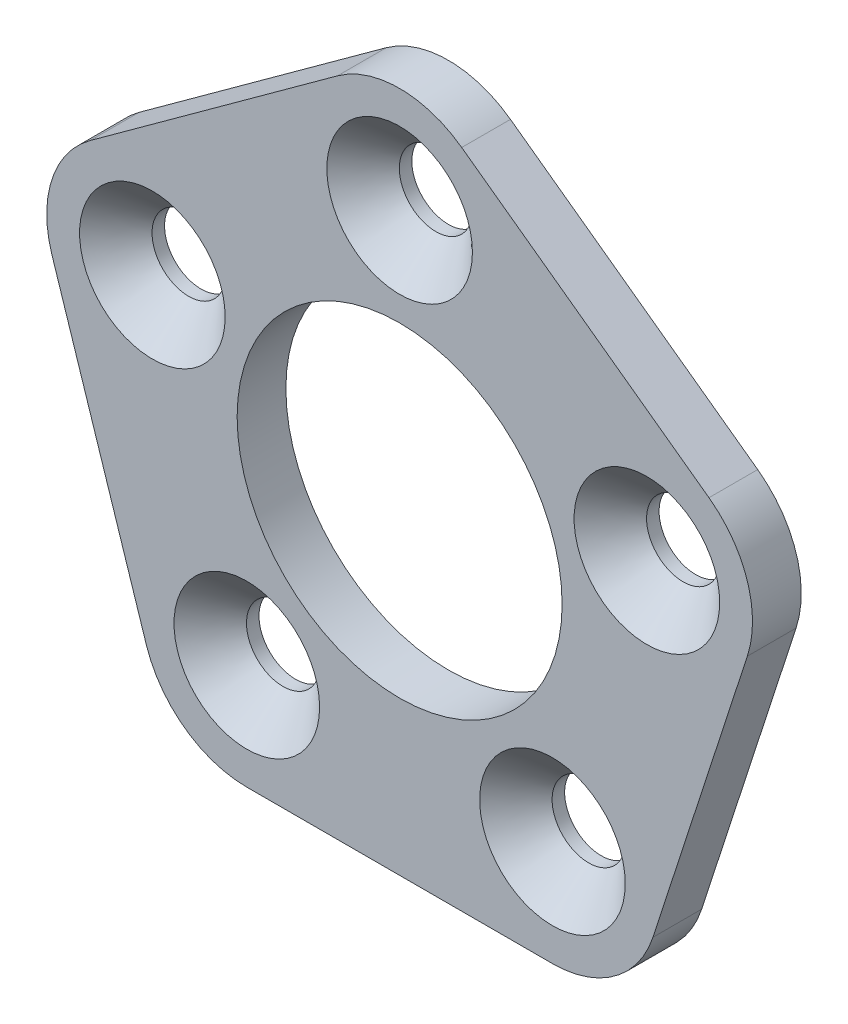
ISO-10303-21;
HEADER;
FILE_DESCRIPTION(('STEP AP214'),'2;1');
FILE_NAME('part.step','',(''),(''),'','','');
FILE_SCHEMA(('AUTOMOTIVE_DESIGN { 1 0 10303 214 1 1 1 1 }'));
ENDSEC;
DATA;
#1=APPLICATION_CONTEXT('core data for automotive mechanical design processes');
#2=APPLICATION_PROTOCOL_DEFINITION('international standard','automotive_design',2000,#1);
#3=PRODUCT_CONTEXT('',#1,'mechanical');
#4=PRODUCT('Part','Part','',(#3));
#5=PRODUCT_RELATED_PRODUCT_CATEGORY('part','',(#4));
#6=PRODUCT_DEFINITION_FORMATION('','',#4);
#7=PRODUCT_DEFINITION_CONTEXT('part definition',#1,'design');
#8=PRODUCT_DEFINITION('design','',#6,#7);
#9=PRODUCT_DEFINITION_SHAPE('','',#8);
#10=(LENGTH_UNIT() NAMED_UNIT(*) SI_UNIT(.MILLI.,.METRE.));
#11=(NAMED_UNIT(*) PLANE_ANGLE_UNIT() SI_UNIT($,.RADIAN.));
#12=(NAMED_UNIT(*) SI_UNIT($,.STERADIAN.) SOLID_ANGLE_UNIT());
#13=UNCERTAINTY_MEASURE_WITH_UNIT(LENGTH_MEASURE(1.E-05),#10,'distance_accuracy_value','');
#14=(GEOMETRIC_REPRESENTATION_CONTEXT(3) GLOBAL_UNCERTAINTY_ASSIGNED_CONTEXT((#13)) GLOBAL_UNIT_ASSIGNED_CONTEXT((#10,
#11,#12)) REPRESENTATION_CONTEXT('',''));
#15=CARTESIAN_POINT('',(0.,0.,0.));
#16=DIRECTION('',(0.,0.,1.));
#17=DIRECTION('',(1.,0.,0.));
#18=AXIS2_PLACEMENT_3D('',#15,#16,#17);
#19=CARTESIAN_POINT('',(-15.2169042607225,4.94427190999915,-3.));
#20=DIRECTION('',(0.,0.,1.));
#21=DIRECTION('',(1.,0.,0.));
#22=AXIS2_PLACEMENT_3D('',#19,#20,#21);
#23=CYLINDRICAL_SURFACE('',#22,6.50000000000001);
#24=CARTESIAN_POINT('',(-15.2169042607225,4.94427190999915,0.));
#25=DIRECTION('',(0.,0.,1.));
#26=DIRECTION('',(1.,0.,0.));
#27=AXIS2_PLACEMENT_3D('',#24,#25,#26);
#28=CIRCLE('',#27,6.50000000000001);
#29=CARTESIAN_POINT('',(-19.0375084006235,10.2028823734363,0.));
#30=VERTEX_POINT('',#29);
#31=CARTESIAN_POINT('',(-21.398771616641,2.93566144656199,0.));
#32=VERTEX_POINT('',#31);
#33=EDGE_CURVE('E159',#30,#32,#28,.T.);
#34=ORIENTED_EDGE('',*,*,#33,.F.);
#35=DIRECTION('',(0.,0.,1.));
#36=VECTOR('',#35,1.);
#37=CARTESIAN_POINT('',(-19.0375084006235,10.2028823734363,-3.));
#38=LINE('',#37,#36);
#39=CARTESIAN_POINT('',(-19.0375084006235,10.2028823734363,-3.));
#40=VERTEX_POINT('',#39);
#41=EDGE_CURVE('E11',#40,#30,#38,.T.);
#42=ORIENTED_EDGE('',*,*,#41,.F.);
#43=CARTESIAN_POINT('',(-15.2169042607225,4.94427190999915,-3.));
#44=DIRECTION('',(0.,0.,1.));
#45=DIRECTION('',(1.,0.,0.));
#46=AXIS2_PLACEMENT_3D('',#43,#44,#45);
#47=CIRCLE('',#46,6.50000000000001);
#48=CARTESIAN_POINT('',(-21.398771616641,2.93566144656199,-3.));
#49=VERTEX_POINT('',#48);
#50=EDGE_CURVE('E196',#40,#49,#47,.T.);
#51=ORIENTED_EDGE('',*,*,#50,.T.);
#52=DIRECTION('',(0.,0.,1.));
#53=VECTOR('',#52,1.);
#54=CARTESIAN_POINT('',(-21.398771616641,2.93566144656199,-3.));
#55=LINE('',#54,#53);
#56=EDGE_CURVE('E106',#49,#32,#55,.T.);
#57=ORIENTED_EDGE('',*,*,#56,.T.);
#58=EDGE_LOOP('',(#34,#42,#51,#57));
#59=FACE_BOUND('',#58,.T.);
#60=ADVANCED_FACE('F43',(#59),#23,.T.);
#61=CARTESIAN_POINT('',(-19.0375084006235,10.2028823734363,-3.));
#62=DIRECTION('',(-0.587785252292473,0.809016994374947,0.));
#63=DIRECTION('',(-0.809016994374947,-0.587785252292473,0.));
#64=AXIS2_PLACEMENT_3D('',#61,#62,#63);
#65=PLANE('',#64);
#66=DIRECTION('',(-0.809016994374947,-0.587785252292473,0.));
#67=VECTOR('',#66,1.);
#68=CARTESIAN_POINT('',(-19.0375084006235,10.2028823734363,0.));
#69=LINE('',#68,#67);
#70=CARTESIAN_POINT('',(-3.82060413990108,21.2586104634372,0.));
#71=VERTEX_POINT('',#70);
#72=EDGE_CURVE('E193',#71,#30,#69,.T.);
#73=ORIENTED_EDGE('',*,*,#72,.F.);
#74=DIRECTION('',(0.,0.,1.));
#75=VECTOR('',#74,1.);
#76=CARTESIAN_POINT('',(-3.82060413990108,21.2586104634372,-3.));
#77=LINE('',#76,#75);
#78=CARTESIAN_POINT('',(-3.82060413990108,21.2586104634372,-3.));
#79=VERTEX_POINT('',#78);
#80=EDGE_CURVE('E53',#79,#71,#77,.T.);
#81=ORIENTED_EDGE('',*,*,#80,.F.);
#82=DIRECTION('',(-0.809016994374947,-0.587785252292473,0.));
#83=VECTOR('',#82,1.);
#84=CARTESIAN_POINT('',(-19.0375084006235,10.2028823734363,-3.));
#85=LINE('',#84,#83);
#86=EDGE_CURVE('E145',#79,#40,#85,.T.);
#87=ORIENTED_EDGE('',*,*,#86,.T.);
#88=ORIENTED_EDGE('',*,*,#41,.T.);
#89=EDGE_LOOP('',(#73,#81,#87,#88));
#90=FACE_BOUND('',#89,.T.);
#91=ADVANCED_FACE('F316',(#90),#65,.T.);
#92=CARTESIAN_POINT('',(0.,16.,-3.));
#93=DIRECTION('',(0.,0.,1.));
#94=DIRECTION('',(1.,0.,0.));
#95=AXIS2_PLACEMENT_3D('',#92,#93,#94);
#96=CYLINDRICAL_SURFACE('',#95,6.5);
#97=CARTESIAN_POINT('',(0.,16.,0.));
#98=DIRECTION('',(0.,0.,1.));
#99=DIRECTION('',(1.,0.,0.));
#100=AXIS2_PLACEMENT_3D('',#97,#98,#99);
#101=CIRCLE('',#100,6.5);
#102=CARTESIAN_POINT('',(3.82060413990108,21.2586104634372,0.));
#103=VERTEX_POINT('',#102);
#104=EDGE_CURVE('E131',#103,#71,#101,.T.);
#105=ORIENTED_EDGE('',*,*,#104,.F.);
#106=DIRECTION('',(0.,0.,1.));
#107=VECTOR('',#106,1.);
#108=CARTESIAN_POINT('',(3.82060413990108,21.2586104634372,-3.));
#109=LINE('',#108,#107);
#110=CARTESIAN_POINT('',(3.82060413990108,21.2586104634372,-3.));
#111=VERTEX_POINT('',#110);
#112=EDGE_CURVE('E126',#111,#103,#109,.T.);
#113=ORIENTED_EDGE('',*,*,#112,.F.);
#114=CARTESIAN_POINT('',(0.,16.,-3.));
#115=DIRECTION('',(0.,0.,1.));
#116=DIRECTION('',(1.,0.,0.));
#117=AXIS2_PLACEMENT_3D('',#114,#115,#116);
#118=CIRCLE('',#117,6.5);
#119=EDGE_CURVE('E129',#111,#79,#118,.T.);
#120=ORIENTED_EDGE('',*,*,#119,.T.);
#121=ORIENTED_EDGE('',*,*,#80,.T.);
#122=EDGE_LOOP('',(#105,#113,#120,#121));
#123=FACE_BOUND('',#122,.T.);
#124=ADVANCED_FACE('F128',(#123),#96,.T.);
#125=CARTESIAN_POINT('',(3.82060413990108,21.2586104634372,-3.));
#126=DIRECTION('',(0.587785252292473,0.809016994374947,0.));
#127=DIRECTION('',(-0.809016994374948,0.587785252292473,0.));
#128=AXIS2_PLACEMENT_3D('',#125,#126,#127);
#129=PLANE('',#128);
#130=DIRECTION('',(-0.809016994374947,0.587785252292473,0.));
#131=VECTOR('',#130,1.);
#132=CARTESIAN_POINT('',(3.82060413990108,21.2586104634372,0.));
#133=LINE('',#132,#131);
#134=CARTESIAN_POINT('',(19.0375084006235,10.2028823734363,0.));
#135=VERTEX_POINT('',#134);
#136=EDGE_CURVE('E188',#135,#103,#133,.T.);
#137=ORIENTED_EDGE('',*,*,#136,.F.);
#138=DIRECTION('',(0.,0.,1.));
#139=VECTOR('',#138,1.);
#140=CARTESIAN_POINT('',(19.0375084006235,10.2028823734363,-3.));
#141=LINE('',#140,#139);
#142=CARTESIAN_POINT('',(19.0375084006235,10.2028823734363,-3.));
#143=VERTEX_POINT('',#142);
#144=EDGE_CURVE('E137',#143,#135,#141,.T.);
#145=ORIENTED_EDGE('',*,*,#144,.F.);
#146=DIRECTION('',(-0.809016994374947,0.587785252292473,0.));
#147=VECTOR('',#146,1.);
#148=CARTESIAN_POINT('',(3.82060413990108,21.2586104634372,-3.));
#149=LINE('',#148,#147);
#150=EDGE_CURVE('E143',#143,#111,#149,.T.);
#151=ORIENTED_EDGE('',*,*,#150,.T.);
#152=ORIENTED_EDGE('',*,*,#112,.T.);
#153=EDGE_LOOP('',(#137,#145,#151,#152));
#154=FACE_BOUND('',#153,.T.);
#155=ADVANCED_FACE('F148',(#154),#129,.T.);
#156=CARTESIAN_POINT('',(15.2169042607225,4.94427190999916,-3.));
#157=DIRECTION('',(0.,0.,1.));
#158=DIRECTION('',(1.,0.,0.));
#159=AXIS2_PLACEMENT_3D('',#156,#157,#158);
#160=CYLINDRICAL_SURFACE('',#159,6.5);
#161=CARTESIAN_POINT('',(15.2169042607225,4.94427190999916,0.));
#162=DIRECTION('',(0.,0.,1.));
#163=DIRECTION('',(1.,0.,0.));
#164=AXIS2_PLACEMENT_3D('',#161,#162,#163);
#165=CIRCLE('',#164,6.5);
#166=CARTESIAN_POINT('',(21.398771616641,2.935661446562,0.));
#167=VERTEX_POINT('',#166);
#168=EDGE_CURVE('E184',#167,#135,#165,.T.);
#169=ORIENTED_EDGE('',*,*,#168,.F.);
#170=DIRECTION('',(0.,0.,1.));
#171=VECTOR('',#170,1.);
#172=CARTESIAN_POINT('',(21.398771616641,2.935661446562,-3.));
#173=LINE('',#172,#171);
#174=CARTESIAN_POINT('',(21.398771616641,2.935661446562,-3.));
#175=VERTEX_POINT('',#174);
#176=EDGE_CURVE('E202',#175,#167,#173,.T.);
#177=ORIENTED_EDGE('',*,*,#176,.F.);
#178=CARTESIAN_POINT('',(15.2169042607225,4.94427190999916,-3.));
#179=DIRECTION('',(0.,0.,1.));
#180=DIRECTION('',(1.,0.,0.));
#181=AXIS2_PLACEMENT_3D('',#178,#179,#180);
#182=CIRCLE('',#181,6.5);
#183=EDGE_CURVE('E150',#175,#143,#182,.T.);
#184=ORIENTED_EDGE('',*,*,#183,.T.);
#185=ORIENTED_EDGE('',*,*,#144,.T.);
#186=EDGE_LOOP('',(#169,#177,#184,#185));
#187=FACE_BOUND('',#186,.T.);
#188=ADVANCED_FACE('F329',(#187),#160,.T.);
#189=CARTESIAN_POINT('',(15.5864313925981,-14.9528823734363,-3.));
#190=DIRECTION('',(0.951056516295153,-0.309016994374948,0.));
#191=DIRECTION('',(0.309016994374948,0.951056516295154,0.));
#192=AXIS2_PLACEMENT_3D('',#189,#190,#191);
#193=PLANE('',#192);
#194=DIRECTION('',(0.309016994374948,0.951056516295154,0.));
#195=VECTOR('',#194,1.);
#196=CARTESIAN_POINT('',(15.5864313925981,-14.9528823734363,0.));
#197=LINE('',#196,#195);
#198=CARTESIAN_POINT('',(15.5864313925981,-14.9528823734363,0.));
#199=VERTEX_POINT('',#198);
#200=EDGE_CURVE('E180',#199,#167,#197,.T.);
#201=ORIENTED_EDGE('',*,*,#200,.F.);
#202=DIRECTION('',(0.,0.,1.));
#203=VECTOR('',#202,1.);
#204=CARTESIAN_POINT('',(15.5864313925981,-14.9528823734363,-3.));
#205=LINE('',#204,#203);
#206=CARTESIAN_POINT('',(15.5864313925981,-14.9528823734363,-3.));
#207=VERTEX_POINT('',#206);
#208=EDGE_CURVE('E205',#207,#199,#205,.T.);
#209=ORIENTED_EDGE('',*,*,#208,.F.);
#210=DIRECTION('',(0.309016994374948,0.951056516295154,0.));
#211=VECTOR('',#210,1.);
#212=CARTESIAN_POINT('',(15.5864313925981,-14.9528823734363,-3.));
#213=LINE('',#212,#211);
#214=EDGE_CURVE('E153',#207,#175,#213,.T.);
#215=ORIENTED_EDGE('',*,*,#214,.T.);
#216=ORIENTED_EDGE('',*,*,#176,.T.);
#217=EDGE_LOOP('',(#201,#209,#215,#216));
#218=FACE_BOUND('',#217,.T.);
#219=ADVANCED_FACE('F299',(#218),#193,.T.);
#220=CARTESIAN_POINT('',(9.40456403667958,-12.9442719099992,-3.));
#221=DIRECTION('',(0.,0.,1.));
#222=DIRECTION('',(1.,0.,0.));
#223=AXIS2_PLACEMENT_3D('',#220,#221,#222);
#224=CYLINDRICAL_SURFACE('',#223,6.5);
#225=CARTESIAN_POINT('',(9.40456403667958,-12.9442719099992,0.));
#226=DIRECTION('',(0.,0.,1.));
#227=DIRECTION('',(1.,0.,0.));
#228=AXIS2_PLACEMENT_3D('',#225,#226,#227);
#229=CIRCLE('',#228,6.5);
#230=CARTESIAN_POINT('',(9.40456403667958,-19.4442719099992,0.));
#231=VERTEX_POINT('',#230);
#232=EDGE_CURVE('E176',#231,#199,#229,.T.);
#233=ORIENTED_EDGE('',*,*,#232,.F.);
#234=DIRECTION('',(0.,0.,1.));
#235=VECTOR('',#234,1.);
#236=CARTESIAN_POINT('',(9.40456403667958,-19.4442719099992,-3.));
#237=LINE('',#236,#235);
#238=CARTESIAN_POINT('',(9.40456403667958,-19.4442719099992,-3.));
#239=VERTEX_POINT('',#238);
#240=EDGE_CURVE('E208',#239,#231,#237,.T.);
#241=ORIENTED_EDGE('',*,*,#240,.F.);
#242=CARTESIAN_POINT('',(9.40456403667958,-12.9442719099992,-3.));
#243=DIRECTION('',(0.,0.,1.));
#244=DIRECTION('',(1.,0.,0.));
#245=AXIS2_PLACEMENT_3D('',#242,#243,#244);
#246=CIRCLE('',#245,6.5);
#247=EDGE_CURVE('E291',#239,#207,#246,.T.);
#248=ORIENTED_EDGE('',*,*,#247,.T.);
#249=ORIENTED_EDGE('',*,*,#208,.T.);
#250=EDGE_LOOP('',(#233,#241,#248,#249));
#251=FACE_BOUND('',#250,.T.);
#252=ADVANCED_FACE('F305',(#251),#224,.T.);
#253=CARTESIAN_POINT('',(-9.40456403667956,-19.4442719099992,-3.));
#254=DIRECTION('',(0.,-1.,0.));
#255=DIRECTION('',(0.,0.,-1.));
#256=AXIS2_PLACEMENT_3D('',#253,#254,#255);
#257=PLANE('',#256);
#258=DIRECTION('',(1.,0.,0.));
#259=VECTOR('',#258,1.);
#260=CARTESIAN_POINT('',(-9.40456403667956,-19.4442719099992,0.));
#261=LINE('',#260,#259);
#262=CARTESIAN_POINT('',(-9.40456403667956,-19.4442719099992,0.));
#263=VERTEX_POINT('',#262);
#264=EDGE_CURVE('E172',#263,#231,#261,.T.);
#265=ORIENTED_EDGE('',*,*,#264,.F.);
#266=DIRECTION('',(0.,0.,1.));
#267=VECTOR('',#266,1.);
#268=CARTESIAN_POINT('',(-9.40456403667956,-19.4442719099992,-3.));
#269=LINE('',#268,#267);
#270=CARTESIAN_POINT('',(-9.40456403667956,-19.4442719099992,-3.));
#271=VERTEX_POINT('',#270);
#272=EDGE_CURVE('E211',#271,#263,#269,.T.);
#273=ORIENTED_EDGE('',*,*,#272,.F.);
#274=DIRECTION('',(1.,0.,0.));
#275=VECTOR('',#274,1.);
#276=CARTESIAN_POINT('',(-9.40456403667956,-19.4442719099992,-3.));
#277=LINE('',#276,#275);
#278=EDGE_CURVE('E287',#271,#239,#277,.T.);
#279=ORIENTED_EDGE('',*,*,#278,.T.);
#280=ORIENTED_EDGE('',*,*,#240,.T.);
#281=EDGE_LOOP('',(#265,#273,#279,#280));
#282=FACE_BOUND('',#281,.T.);
#283=ADVANCED_FACE('F308',(#282),#257,.T.);
#284=CARTESIAN_POINT('',(-9.40456403667957,-12.9442719099992,-3.));
#285=DIRECTION('',(0.,0.,1.));
#286=DIRECTION('',(1.,0.,0.));
#287=AXIS2_PLACEMENT_3D('',#284,#285,#286);
#288=CYLINDRICAL_SURFACE('',#287,6.5);
#289=CARTESIAN_POINT('',(-9.40456403667957,-12.9442719099992,0.));
#290=DIRECTION('',(0.,0.,1.));
#291=DIRECTION('',(1.,0.,0.));
#292=AXIS2_PLACEMENT_3D('',#289,#290,#291);
#293=CIRCLE('',#292,6.5);
#294=CARTESIAN_POINT('',(-15.5864313925981,-14.9528823734363,0.));
#295=VERTEX_POINT('',#294);
#296=EDGE_CURVE('E168',#295,#263,#293,.T.);
#297=ORIENTED_EDGE('',*,*,#296,.F.);
#298=DIRECTION('',(0.,0.,1.));
#299=VECTOR('',#298,1.);
#300=CARTESIAN_POINT('',(-15.5864313925981,-14.9528823734363,-3.));
#301=LINE('',#300,#299);
#302=CARTESIAN_POINT('',(-15.5864313925981,-14.9528823734363,-3.));
#303=VERTEX_POINT('',#302);
#304=EDGE_CURVE('E214',#303,#295,#301,.T.);
#305=ORIENTED_EDGE('',*,*,#304,.F.);
#306=CARTESIAN_POINT('',(-9.40456403667957,-12.9442719099992,-3.));
#307=DIRECTION('',(0.,0.,1.));
#308=DIRECTION('',(1.,0.,0.));
#309=AXIS2_PLACEMENT_3D('',#306,#307,#308);
#310=CIRCLE('',#309,6.5);
#311=EDGE_CURVE('E283',#303,#271,#310,.T.);
#312=ORIENTED_EDGE('',*,*,#311,.T.);
#313=ORIENTED_EDGE('',*,*,#272,.T.);
#314=EDGE_LOOP('',(#297,#305,#312,#313));
#315=FACE_BOUND('',#314,.T.);
#316=ADVANCED_FACE('F312',(#315),#288,.T.);
#317=CARTESIAN_POINT('',(-21.398771616641,2.93566144656199,-3.));
#318=DIRECTION('',(-0.951056516295154,-0.309016994374948,0.));
#319=DIRECTION('',(0.309016994374948,-0.951056516295154,0.));
#320=AXIS2_PLACEMENT_3D('',#317,#318,#319);
#321=PLANE('',#320);
#322=DIRECTION('',(0.309016994374948,-0.951056516295153,0.));
#323=VECTOR('',#322,1.);
#324=CARTESIAN_POINT('',(-21.398771616641,2.93566144656199,0.));
#325=LINE('',#324,#323);
#326=EDGE_CURVE('E163',#32,#295,#325,.T.);
#327=ORIENTED_EDGE('',*,*,#326,.F.);
#328=ORIENTED_EDGE('',*,*,#56,.F.);
#329=DIRECTION('',(0.309016994374948,-0.951056516295153,0.));
#330=VECTOR('',#329,1.);
#331=CARTESIAN_POINT('',(-21.398771616641,2.93566144656199,-3.));
#332=LINE('',#331,#330);
#333=EDGE_CURVE('E280',#49,#303,#332,.T.);
#334=ORIENTED_EDGE('',*,*,#333,.T.);
#335=ORIENTED_EDGE('',*,*,#304,.T.);
#336=EDGE_LOOP('',(#327,#328,#334,#335));
#337=FACE_BOUND('',#336,.T.);
#338=ADVANCED_FACE('F313',(#337),#321,.T.);
#339=CARTESIAN_POINT('',(-15.2169042607225,4.94427190999915,-3.));
#340=DIRECTION('',(0.,0.,1.));
#341=DIRECTION('',(1.,0.,0.));
#342=AXIS2_PLACEMENT_3D('',#339,#340,#341);
#343=PLANE('',#342);
#344=CARTESIAN_POINT('',(0.,16.,-3.));
#345=DIRECTION('',(0.,0.,1.));
#346=DIRECTION('',(1.,0.,0.));
#347=AXIS2_PLACEMENT_3D('',#344,#345,#346);
#348=CIRCLE('',#347,2.25);
#349=CARTESIAN_POINT('',(2.25,16.,-3.));
#350=VERTEX_POINT('',#349);
#351=EDGE_CURVE('E46',#350,#350,#348,.T.);
#352=ORIENTED_EDGE('',*,*,#351,.T.);
#353=EDGE_LOOP('',(#352));
#354=FACE_BOUND('',#353,.T.);
#355=CARTESIAN_POINT('',(15.2169042607225,4.94427190999916,-3.));
#356=DIRECTION('',(0.,0.,1.));
#357=DIRECTION('',(1.,0.,0.));
#358=AXIS2_PLACEMENT_3D('',#355,#356,#357);
#359=CIRCLE('',#358,2.25);
#360=CARTESIAN_POINT('',(17.4669042607225,4.94427190999916,-3.));
#361=VERTEX_POINT('',#360);
#362=EDGE_CURVE('E236',#361,#361,#359,.T.);
#363=ORIENTED_EDGE('',*,*,#362,.T.);
#364=EDGE_LOOP('',(#363));
#365=FACE_BOUND('',#364,.T.);
#366=CARTESIAN_POINT('',(9.40456403667957,-12.9442719099992,-3.));
#367=DIRECTION('',(0.,0.,1.));
#368=DIRECTION('',(1.,0.,0.));
#369=AXIS2_PLACEMENT_3D('',#366,#367,#368);
#370=CIRCLE('',#369,2.25);
#371=CARTESIAN_POINT('',(11.6545640366796,-12.9442719099992,-3.));
#372=VERTEX_POINT('',#371);
#373=EDGE_CURVE('E231',#372,#372,#370,.T.);
#374=ORIENTED_EDGE('',*,*,#373,.T.);
#375=EDGE_LOOP('',(#374));
#376=FACE_BOUND('',#375,.T.);
#377=CARTESIAN_POINT('',(-9.40456403667957,-12.9442719099992,-3.));
#378=DIRECTION('',(0.,0.,1.));
#379=DIRECTION('',(1.,0.,0.));
#380=AXIS2_PLACEMENT_3D('',#377,#378,#379);
#381=CIRCLE('',#380,2.25);
#382=CARTESIAN_POINT('',(-7.15456403667957,-12.9442719099992,-3.));
#383=VERTEX_POINT('',#382);
#384=EDGE_CURVE('E225',#383,#383,#381,.T.);
#385=ORIENTED_EDGE('',*,*,#384,.T.);
#386=EDGE_LOOP('',(#385));
#387=FACE_BOUND('',#386,.T.);
#388=CARTESIAN_POINT('',(-15.2169042607225,4.94427190999916,-3.));
#389=DIRECTION('',(0.,0.,1.));
#390=DIRECTION('',(1.,0.,0.));
#391=AXIS2_PLACEMENT_3D('',#388,#389,#390);
#392=CIRCLE('',#391,2.25);
#393=CARTESIAN_POINT('',(-12.9669042607225,4.94427190999916,-3.));
#394=VERTEX_POINT('',#393);
#395=EDGE_CURVE('E219',#394,#394,#392,.T.);
#396=ORIENTED_EDGE('',*,*,#395,.T.);
#397=EDGE_LOOP('',(#396));
#398=FACE_BOUND('',#397,.T.);
#399=CARTESIAN_POINT('',(0.,0.,-3.));
#400=DIRECTION('',(0.,0.,1.));
#401=DIRECTION('',(1.,0.,0.));
#402=AXIS2_PLACEMENT_3D('',#399,#400,#401);
#403=CIRCLE('',#402,10.);
#404=CARTESIAN_POINT('',(10.,0.,-3.));
#405=VERTEX_POINT('',#404);
#406=EDGE_CURVE('E164',#405,#405,#403,.T.);
#407=ORIENTED_EDGE('',*,*,#406,.T.);
#408=EDGE_LOOP('',(#407));
#409=FACE_BOUND('',#408,.T.);
#410=ORIENTED_EDGE('',*,*,#50,.F.);
#411=ORIENTED_EDGE('',*,*,#86,.F.);
#412=ORIENTED_EDGE('',*,*,#119,.F.);
#413=ORIENTED_EDGE('',*,*,#150,.F.);
#414=ORIENTED_EDGE('',*,*,#183,.F.);
#415=ORIENTED_EDGE('',*,*,#214,.F.);
#416=ORIENTED_EDGE('',*,*,#247,.F.);
#417=ORIENTED_EDGE('',*,*,#278,.F.);
#418=ORIENTED_EDGE('',*,*,#311,.F.);
#419=ORIENTED_EDGE('',*,*,#333,.F.);
#420=EDGE_LOOP('',(#410,#411,#412,#413,#414,#415,#416,#417,#418,#419));
#421=FACE_BOUND('',#420,.T.);
#422=ADVANCED_FACE('F141',(#354,#365,#376,#387,#398,#409,#421),#343,.F.);
#423=CARTESIAN_POINT('',(-15.2169042607225,4.94427190999915,0.));
#424=DIRECTION('',(0.,0.,1.));
#425=DIRECTION('',(1.,0.,0.));
#426=AXIS2_PLACEMENT_3D('',#423,#424,#425);
#427=PLANE('',#426);
#428=CARTESIAN_POINT('',(0.,16.,0.));
#429=DIRECTION('',(0.,0.,1.));
#430=DIRECTION('',(1.,0.,0.));
#431=AXIS2_PLACEMENT_3D('',#428,#429,#430);
#432=CIRCLE('',#431,4.48);
#433=CARTESIAN_POINT('',(4.48,16.,0.));
#434=VERTEX_POINT('',#433);
#435=EDGE_CURVE('E401',#434,#434,#432,.T.);
#436=ORIENTED_EDGE('',*,*,#435,.F.);
#437=EDGE_LOOP('',(#436));
#438=FACE_BOUND('',#437,.T.);
#439=CARTESIAN_POINT('',(15.2169042607225,4.94427190999916,0.));
#440=DIRECTION('',(0.,0.,1.));
#441=DIRECTION('',(1.,0.,0.));
#442=AXIS2_PLACEMENT_3D('',#439,#440,#441);
#443=CIRCLE('',#442,4.48);
#444=CARTESIAN_POINT('',(19.6969042607225,4.94427190999916,0.));
#445=VERTEX_POINT('',#444);
#446=EDGE_CURVE('E248',#445,#445,#443,.T.);
#447=ORIENTED_EDGE('',*,*,#446,.F.);
#448=EDGE_LOOP('',(#447));
#449=FACE_BOUND('',#448,.T.);
#450=CARTESIAN_POINT('',(9.40456403667957,-12.9442719099992,0.));
#451=DIRECTION('',(0.,0.,1.));
#452=DIRECTION('',(1.,0.,0.));
#453=AXIS2_PLACEMENT_3D('',#450,#451,#452);
#454=CIRCLE('',#453,4.48);
#455=CARTESIAN_POINT('',(13.8845640366796,-12.9442719099992,0.));
#456=VERTEX_POINT('',#455);
#457=EDGE_CURVE('E239',#456,#456,#454,.T.);
#458=ORIENTED_EDGE('',*,*,#457,.F.);
#459=EDGE_LOOP('',(#458));
#460=FACE_BOUND('',#459,.T.);
#461=CARTESIAN_POINT('',(-9.40456403667957,-12.9442719099992,0.));
#462=DIRECTION('',(0.,0.,1.));
#463=DIRECTION('',(1.,0.,0.));
#464=AXIS2_PLACEMENT_3D('',#461,#462,#463);
#465=CIRCLE('',#464,4.48);
#466=CARTESIAN_POINT('',(-4.92456403667957,-12.9442719099992,0.));
#467=VERTEX_POINT('',#466);
#468=EDGE_CURVE('E234',#467,#467,#465,.T.);
#469=ORIENTED_EDGE('',*,*,#468,.F.);
#470=EDGE_LOOP('',(#469));
#471=FACE_BOUND('',#470,.T.);
#472=CARTESIAN_POINT('',(-15.2169042607225,4.94427190999916,0.));
#473=DIRECTION('',(0.,0.,1.));
#474=DIRECTION('',(1.,0.,0.));
#475=AXIS2_PLACEMENT_3D('',#472,#473,#474);
#476=CIRCLE('',#475,4.48);
#477=CARTESIAN_POINT('',(-10.7369042607225,4.94427190999916,0.));
#478=VERTEX_POINT('',#477);
#479=EDGE_CURVE('E229',#478,#478,#476,.T.);
#480=ORIENTED_EDGE('',*,*,#479,.F.);
#481=EDGE_LOOP('',(#480));
#482=FACE_BOUND('',#481,.T.);
#483=CARTESIAN_POINT('',(0.,0.,0.));
#484=DIRECTION('',(0.,0.,1.));
#485=DIRECTION('',(1.,0.,0.));
#486=AXIS2_PLACEMENT_3D('',#483,#484,#485);
#487=CIRCLE('',#486,10.);
#488=CARTESIAN_POINT('',(10.,0.,0.));
#489=VERTEX_POINT('',#488);
#490=EDGE_CURVE('E223',#489,#489,#487,.T.);
#491=ORIENTED_EDGE('',*,*,#490,.F.);
#492=EDGE_LOOP('',(#491));
#493=FACE_BOUND('',#492,.T.);
#494=ORIENTED_EDGE('',*,*,#33,.T.);
#495=ORIENTED_EDGE('',*,*,#326,.T.);
#496=ORIENTED_EDGE('',*,*,#296,.T.);
#497=ORIENTED_EDGE('',*,*,#264,.T.);
#498=ORIENTED_EDGE('',*,*,#232,.T.);
#499=ORIENTED_EDGE('',*,*,#200,.T.);
#500=ORIENTED_EDGE('',*,*,#168,.T.);
#501=ORIENTED_EDGE('',*,*,#136,.T.);
#502=ORIENTED_EDGE('',*,*,#104,.T.);
#503=ORIENTED_EDGE('',*,*,#72,.T.);
#504=EDGE_LOOP('',(#494,#495,#496,#497,#498,#499,#500,#501,#502,#503));
#505=FACE_BOUND('',#504,.T.);
#506=ADVANCED_FACE('F315',(#438,#449,#460,#471,#482,#493,#505),#427,.T.);
#507=CARTESIAN_POINT('',(0.,0.,-3.));
#508=DIRECTION('',(0.,0.,1.));
#509=DIRECTION('',(1.,0.,0.));
#510=AXIS2_PLACEMENT_3D('',#507,#508,#509);
#511=CYLINDRICAL_SURFACE('',#510,10.);
#512=ORIENTED_EDGE('',*,*,#406,.F.);
#513=EDGE_LOOP('',(#512));
#514=FACE_BOUND('',#513,.T.);
#515=ORIENTED_EDGE('',*,*,#490,.T.);
#516=EDGE_LOOP('',(#515));
#517=FACE_BOUND('',#516,.T.);
#518=ADVANCED_FACE('F349',(#514,#517),#511,.F.);
#519=CARTESIAN_POINT('',(-15.2169042607225,4.94427190999916,0.));
#520=DIRECTION('',(0.,0.,1.));
#521=DIRECTION('',(1.,0.,0.));
#522=AXIS2_PLACEMENT_3D('',#519,#520,#521);
#523=CYLINDRICAL_SURFACE('',#522,2.25);
#524=CARTESIAN_POINT('',(-15.2169042607225,4.94427190999916,-2.23));
#525=DIRECTION('',(0.,0.,1.));
#526=DIRECTION('',(1.,0.,0.));
#527=AXIS2_PLACEMENT_3D('',#524,#525,#526);
#528=CIRCLE('',#527,2.25);
#529=CARTESIAN_POINT('',(-12.9669042607225,4.94427190999916,-2.23));
#530=VERTEX_POINT('',#529);
#531=EDGE_CURVE('E224',#530,#530,#528,.T.);
#532=ORIENTED_EDGE('',*,*,#531,.T.);
#533=EDGE_LOOP('',(#532));
#534=FACE_BOUND('',#533,.T.);
#535=ORIENTED_EDGE('',*,*,#395,.F.);
#536=EDGE_LOOP('',(#535));
#537=FACE_BOUND('',#536,.T.);
#538=ADVANCED_FACE('F354',(#534,#537),#523,.F.);
#539=CARTESIAN_POINT('',(-15.2169042607225,4.94427190999916,0.));
#540=DIRECTION('',(0.,0.,1.));
#541=DIRECTION('',(1.,0.,0.));
#542=AXIS2_PLACEMENT_3D('',#539,#540,#541);
#543=CONICAL_SURFACE('',#542,4.48,0.785398163397448);
#544=ORIENTED_EDGE('',*,*,#531,.F.);
#545=EDGE_LOOP('',(#544));
#546=FACE_BOUND('',#545,.T.);
#547=ORIENTED_EDGE('',*,*,#479,.T.);
#548=EDGE_LOOP('',(#547));
#549=FACE_BOUND('',#548,.T.);
#550=ADVANCED_FACE('F358',(#546,#549),#543,.F.);
#551=CARTESIAN_POINT('',(-9.40456403667957,-12.9442719099992,0.));
#552=DIRECTION('',(0.,0.,1.));
#553=DIRECTION('',(1.,0.,0.));
#554=AXIS2_PLACEMENT_3D('',#551,#552,#553);
#555=CYLINDRICAL_SURFACE('',#554,2.25);
#556=CARTESIAN_POINT('',(-9.40456403667957,-12.9442719099992,-2.23));
#557=DIRECTION('',(0.,0.,1.));
#558=DIRECTION('',(1.,0.,0.));
#559=AXIS2_PLACEMENT_3D('',#556,#557,#558);
#560=CIRCLE('',#559,2.25);
#561=CARTESIAN_POINT('',(-7.15456403667957,-12.9442719099992,-2.23));
#562=VERTEX_POINT('',#561);
#563=EDGE_CURVE('E230',#562,#562,#560,.T.);
#564=ORIENTED_EDGE('',*,*,#563,.T.);
#565=EDGE_LOOP('',(#564));
#566=FACE_BOUND('',#565,.T.);
#567=ORIENTED_EDGE('',*,*,#384,.F.);
#568=EDGE_LOOP('',(#567));
#569=FACE_BOUND('',#568,.T.);
#570=ADVANCED_FACE('F362',(#566,#569),#555,.F.);
#571=CARTESIAN_POINT('',(-9.40456403667957,-12.9442719099992,0.));
#572=DIRECTION('',(0.,0.,1.));
#573=DIRECTION('',(1.,0.,0.));
#574=AXIS2_PLACEMENT_3D('',#571,#572,#573);
#575=CONICAL_SURFACE('',#574,4.48,0.785398163397448);
#576=ORIENTED_EDGE('',*,*,#563,.F.);
#577=EDGE_LOOP('',(#576));
#578=FACE_BOUND('',#577,.T.);
#579=ORIENTED_EDGE('',*,*,#468,.T.);
#580=EDGE_LOOP('',(#579));
#581=FACE_BOUND('',#580,.T.);
#582=ADVANCED_FACE('F366',(#578,#581),#575,.F.);
#583=CARTESIAN_POINT('',(9.40456403667957,-12.9442719099992,0.));
#584=DIRECTION('',(0.,0.,1.));
#585=DIRECTION('',(1.,0.,0.));
#586=AXIS2_PLACEMENT_3D('',#583,#584,#585);
#587=CYLINDRICAL_SURFACE('',#586,2.25);
#588=CARTESIAN_POINT('',(9.40456403667957,-12.9442719099992,-2.23));
#589=DIRECTION('',(0.,0.,1.));
#590=DIRECTION('',(1.,0.,0.));
#591=AXIS2_PLACEMENT_3D('',#588,#589,#590);
#592=CIRCLE('',#591,2.25);
#593=CARTESIAN_POINT('',(11.6545640366796,-12.9442719099992,-2.23));
#594=VERTEX_POINT('',#593);
#595=EDGE_CURVE('E235',#594,#594,#592,.T.);
#596=ORIENTED_EDGE('',*,*,#595,.T.);
#597=EDGE_LOOP('',(#596));
#598=FACE_BOUND('',#597,.T.);
#599=ORIENTED_EDGE('',*,*,#373,.F.);
#600=EDGE_LOOP('',(#599));
#601=FACE_BOUND('',#600,.T.);
#602=ADVANCED_FACE('F370',(#598,#601),#587,.F.);
#603=CARTESIAN_POINT('',(9.40456403667957,-12.9442719099992,0.));
#604=DIRECTION('',(0.,0.,1.));
#605=DIRECTION('',(1.,0.,0.));
#606=AXIS2_PLACEMENT_3D('',#603,#604,#605);
#607=CONICAL_SURFACE('',#606,4.48,0.785398163397449);
#608=ORIENTED_EDGE('',*,*,#595,.F.);
#609=EDGE_LOOP('',(#608));
#610=FACE_BOUND('',#609,.T.);
#611=ORIENTED_EDGE('',*,*,#457,.T.);
#612=EDGE_LOOP('',(#611));
#613=FACE_BOUND('',#612,.T.);
#614=ADVANCED_FACE('F374',(#610,#613),#607,.F.);
#615=CARTESIAN_POINT('',(15.2169042607225,4.94427190999916,0.));
#616=DIRECTION('',(0.,0.,1.));
#617=DIRECTION('',(1.,0.,0.));
#618=AXIS2_PLACEMENT_3D('',#615,#616,#617);
#619=CYLINDRICAL_SURFACE('',#618,2.25);
#620=CARTESIAN_POINT('',(15.2169042607225,4.94427190999916,-2.23));
#621=DIRECTION('',(0.,0.,1.));
#622=DIRECTION('',(1.,0.,0.));
#623=AXIS2_PLACEMENT_3D('',#620,#621,#622);
#624=CIRCLE('',#623,2.25);
#625=CARTESIAN_POINT('',(17.4669042607225,4.94427190999916,-2.23));
#626=VERTEX_POINT('',#625);
#627=EDGE_CURVE('E240',#626,#626,#624,.T.);
#628=ORIENTED_EDGE('',*,*,#627,.T.);
#629=EDGE_LOOP('',(#628));
#630=FACE_BOUND('',#629,.T.);
#631=ORIENTED_EDGE('',*,*,#362,.F.);
#632=EDGE_LOOP('',(#631));
#633=FACE_BOUND('',#632,.T.);
#634=ADVANCED_FACE('F378',(#630,#633),#619,.F.);
#635=CARTESIAN_POINT('',(15.2169042607225,4.94427190999916,0.));
#636=DIRECTION('',(0.,0.,1.));
#637=DIRECTION('',(1.,0.,0.));
#638=AXIS2_PLACEMENT_3D('',#635,#636,#637);
#639=CONICAL_SURFACE('',#638,4.48,0.785398163397448);
#640=ORIENTED_EDGE('',*,*,#627,.F.);
#641=EDGE_LOOP('',(#640));
#642=FACE_BOUND('',#641,.T.);
#643=ORIENTED_EDGE('',*,*,#446,.T.);
#644=EDGE_LOOP('',(#643));
#645=FACE_BOUND('',#644,.T.);
#646=ADVANCED_FACE('F382',(#642,#645),#639,.F.);
#647=CARTESIAN_POINT('',(0.,16.,0.));
#648=DIRECTION('',(0.,0.,1.));
#649=DIRECTION('',(1.,0.,0.));
#650=AXIS2_PLACEMENT_3D('',#647,#648,#649);
#651=CYLINDRICAL_SURFACE('',#650,2.25);
#652=CARTESIAN_POINT('',(0.,16.,-2.23));
#653=DIRECTION('',(0.,0.,1.));
#654=DIRECTION('',(1.,0.,0.));
#655=AXIS2_PLACEMENT_3D('',#652,#653,#654);
#656=CIRCLE('',#655,2.25);
#657=CARTESIAN_POINT('',(2.25,16.,-2.23));
#658=VERTEX_POINT('',#657);
#659=EDGE_CURVE('E398',#658,#658,#656,.T.);
#660=ORIENTED_EDGE('',*,*,#659,.T.);
#661=EDGE_LOOP('',(#660));
#662=FACE_BOUND('',#661,.T.);
#663=ORIENTED_EDGE('',*,*,#351,.F.);
#664=EDGE_LOOP('',(#663));
#665=FACE_BOUND('',#664,.T.);
#666=ADVANCED_FACE('F385',(#662,#665),#651,.F.);
#667=CARTESIAN_POINT('',(0.,16.,0.));
#668=DIRECTION('',(0.,0.,1.));
#669=DIRECTION('',(1.,0.,0.));
#670=AXIS2_PLACEMENT_3D('',#667,#668,#669);
#671=CONICAL_SURFACE('',#670,4.48,0.785398163397449);
#672=ORIENTED_EDGE('',*,*,#659,.F.);
#673=EDGE_LOOP('',(#672));
#674=FACE_BOUND('',#673,.T.);
#675=ORIENTED_EDGE('',*,*,#435,.T.);
#676=EDGE_LOOP('',(#675));
#677=FACE_BOUND('',#676,.T.);
#678=ADVANCED_FACE('F389',(#674,#677),#671,.F.);
#679=CLOSED_SHELL('',(#60,#91,#124,#155,#188,#219,#252,#283,#316,#338,#422,#506,#518,#538,#550,
#570,#582,#602,#614,#634,#646,#666,#678));
#680=MANIFOLD_SOLID_BREP('B2',#679);
#681=ADVANCED_BREP_SHAPE_REPRESENTATION('',(#18,#680),#14);
#682=SHAPE_DEFINITION_REPRESENTATION(#9,#681);
ENDSEC;
END-ISO-10303-21;
